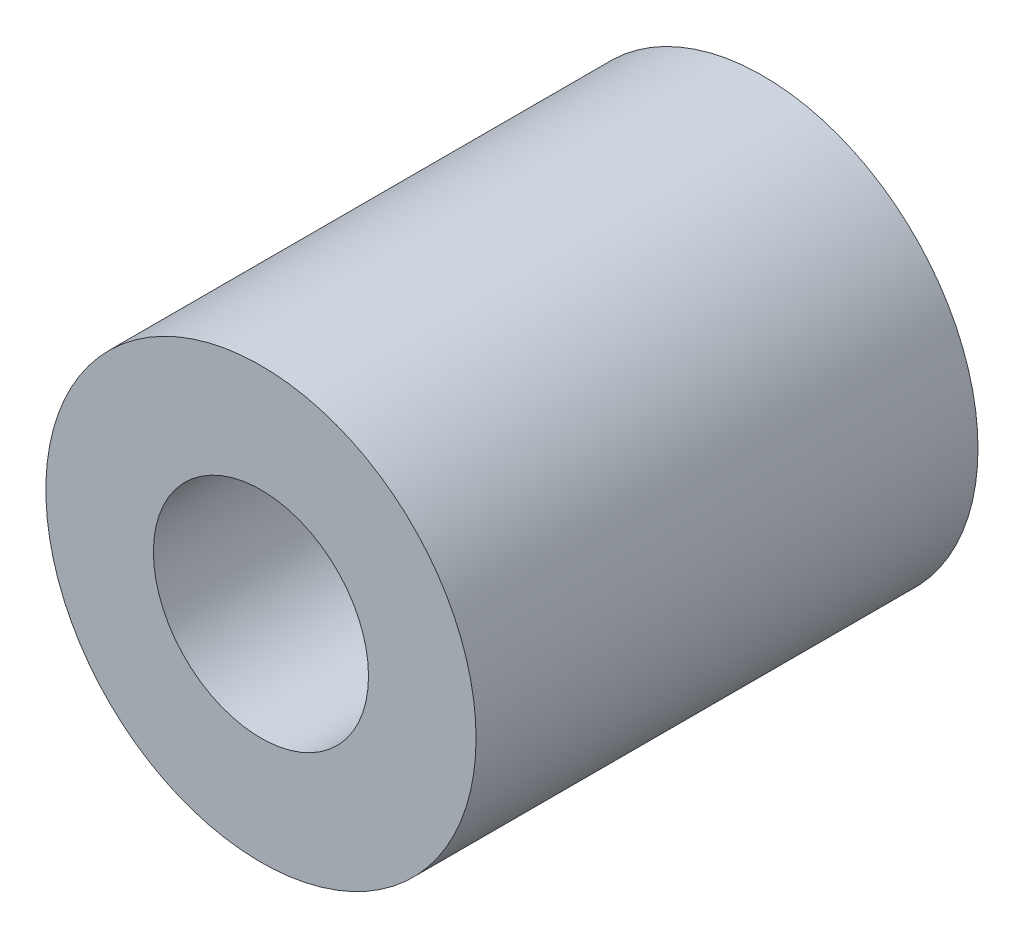
ISO-10303-21;
HEADER;
FILE_DESCRIPTION(('STEP AP214'),'2;1');
FILE_NAME('part.step','',(''),(''),'','','');
FILE_SCHEMA(('AUTOMOTIVE_DESIGN { 1 0 10303 214 1 1 1 1 }'));
ENDSEC;
DATA;
#1=APPLICATION_CONTEXT('core data for automotive mechanical design processes');
#2=APPLICATION_PROTOCOL_DEFINITION('international standard','automotive_design',2000,#1);
#3=PRODUCT_CONTEXT('',#1,'mechanical');
#4=PRODUCT('Part','Part','',(#3));
#5=PRODUCT_RELATED_PRODUCT_CATEGORY('part','',(#4));
#6=PRODUCT_DEFINITION_FORMATION('','',#4);
#7=PRODUCT_DEFINITION_CONTEXT('part definition',#1,'design');
#8=PRODUCT_DEFINITION('design','',#6,#7);
#9=PRODUCT_DEFINITION_SHAPE('','',#8);
#10=(LENGTH_UNIT() NAMED_UNIT(*) SI_UNIT(.MILLI.,.METRE.));
#11=(NAMED_UNIT(*) PLANE_ANGLE_UNIT() SI_UNIT($,.RADIAN.));
#12=(NAMED_UNIT(*) SI_UNIT($,.STERADIAN.) SOLID_ANGLE_UNIT());
#13=UNCERTAINTY_MEASURE_WITH_UNIT(LENGTH_MEASURE(1.E-05),#10,'distance_accuracy_value','');
#14=(GEOMETRIC_REPRESENTATION_CONTEXT(3) GLOBAL_UNCERTAINTY_ASSIGNED_CONTEXT((#13)) GLOBAL_UNIT_ASSIGNED_CONTEXT((#10,
#11,#12)) REPRESENTATION_CONTEXT('',''));
#15=CARTESIAN_POINT('',(0.,0.,0.));
#16=DIRECTION('',(0.,0.,1.));
#17=DIRECTION('',(1.,0.,0.));
#18=AXIS2_PLACEMENT_3D('',#15,#16,#17);
#19=CARTESIAN_POINT('',(0.,0.,7.));
#20=DIRECTION('',(0.,0.,-1.));
#21=DIRECTION('',(-1.,0.,0.));
#22=AXIS2_PLACEMENT_3D('',#19,#20,#21);
#23=CYLINDRICAL_SURFACE('',#22,3.);
#24=CARTESIAN_POINT('',(0.,0.,7.));
#25=DIRECTION('',(0.,0.,1.));
#26=DIRECTION('',(1.,0.,0.));
#27=AXIS2_PLACEMENT_3D('',#24,#25,#26);
#28=CIRCLE('',#27,3.);
#29=CARTESIAN_POINT('',(3.,0.,7.));
#30=VERTEX_POINT('',#29);
#31=EDGE_CURVE('E10',#30,#30,#28,.T.);
#32=ORIENTED_EDGE('',*,*,#31,.F.);
#33=EDGE_LOOP('',(#32));
#34=FACE_BOUND('',#33,.T.);
#35=CARTESIAN_POINT('',(0.,0.,0.));
#36=DIRECTION('',(0.,0.,1.));
#37=DIRECTION('',(1.,0.,0.));
#38=AXIS2_PLACEMENT_3D('',#35,#36,#37);
#39=CIRCLE('',#38,3.);
#40=CARTESIAN_POINT('',(3.,0.,0.));
#41=VERTEX_POINT('',#40);
#42=EDGE_CURVE('E36',#41,#41,#39,.T.);
#43=ORIENTED_EDGE('',*,*,#42,.T.);
#44=EDGE_LOOP('',(#43));
#45=FACE_BOUND('',#44,.T.);
#46=ADVANCED_FACE('F33',(#34,#45),#23,.T.);
#47=CARTESIAN_POINT('',(0.,0.,7.));
#48=DIRECTION('',(0.,0.,1.));
#49=DIRECTION('',(1.,0.,0.));
#50=AXIS2_PLACEMENT_3D('',#47,#48,#49);
#51=PLANE('',#50);
#52=CARTESIAN_POINT('',(0.,0.,7.));
#53=DIRECTION('',(0.,0.,1.));
#54=DIRECTION('',(1.,0.,0.));
#55=AXIS2_PLACEMENT_3D('',#52,#53,#54);
#56=CIRCLE('',#55,1.5);
#57=CARTESIAN_POINT('',(1.5,0.,7.));
#58=VERTEX_POINT('',#57);
#59=EDGE_CURVE('E45',#58,#58,#56,.T.);
#60=ORIENTED_EDGE('',*,*,#59,.F.);
#61=EDGE_LOOP('',(#60));
#62=FACE_BOUND('',#61,.T.);
#63=ORIENTED_EDGE('',*,*,#31,.T.);
#64=EDGE_LOOP('',(#63));
#65=FACE_BOUND('',#64,.T.);
#66=ADVANCED_FACE('F60',(#62,#65),#51,.T.);
#67=CARTESIAN_POINT('',(0.,0.,0.));
#68=DIRECTION('',(0.,0.,1.));
#69=DIRECTION('',(1.,0.,0.));
#70=AXIS2_PLACEMENT_3D('',#67,#68,#69);
#71=PLANE('',#70);
#72=CARTESIAN_POINT('',(0.,0.,0.));
#73=DIRECTION('',(0.,0.,1.));
#74=DIRECTION('',(1.,0.,0.));
#75=AXIS2_PLACEMENT_3D('',#72,#73,#74);
#76=CIRCLE('',#75,1.5);
#77=CARTESIAN_POINT('',(1.5,0.,0.));
#78=VERTEX_POINT('',#77);
#79=EDGE_CURVE('E43',#78,#78,#76,.T.);
#80=ORIENTED_EDGE('',*,*,#79,.T.);
#81=EDGE_LOOP('',(#80));
#82=FACE_BOUND('',#81,.T.);
#83=ORIENTED_EDGE('',*,*,#42,.F.);
#84=EDGE_LOOP('',(#83));
#85=FACE_BOUND('',#84,.T.);
#86=ADVANCED_FACE('F51',(#82,#85),#71,.F.);
#87=CARTESIAN_POINT('',(0.,0.,0.));
#88=DIRECTION('',(0.,0.,1.));
#89=DIRECTION('',(1.,0.,0.));
#90=AXIS2_PLACEMENT_3D('',#87,#88,#89);
#91=CYLINDRICAL_SURFACE('',#90,1.5);
#92=ORIENTED_EDGE('',*,*,#79,.F.);
#93=EDGE_LOOP('',(#92));
#94=FACE_BOUND('',#93,.T.);
#95=ORIENTED_EDGE('',*,*,#59,.T.);
#96=EDGE_LOOP('',(#95));
#97=FACE_BOUND('',#96,.T.);
#98=ADVANCED_FACE('F54',(#94,#97),#91,.F.);
#99=CLOSED_SHELL('',(#46,#66,#86,#98));
#100=MANIFOLD_SOLID_BREP('B2',#99);
#101=ADVANCED_BREP_SHAPE_REPRESENTATION('',(#18,#100),#14);
#102=SHAPE_DEFINITION_REPRESENTATION(#9,#101);
ENDSEC;
END-ISO-10303-21;
